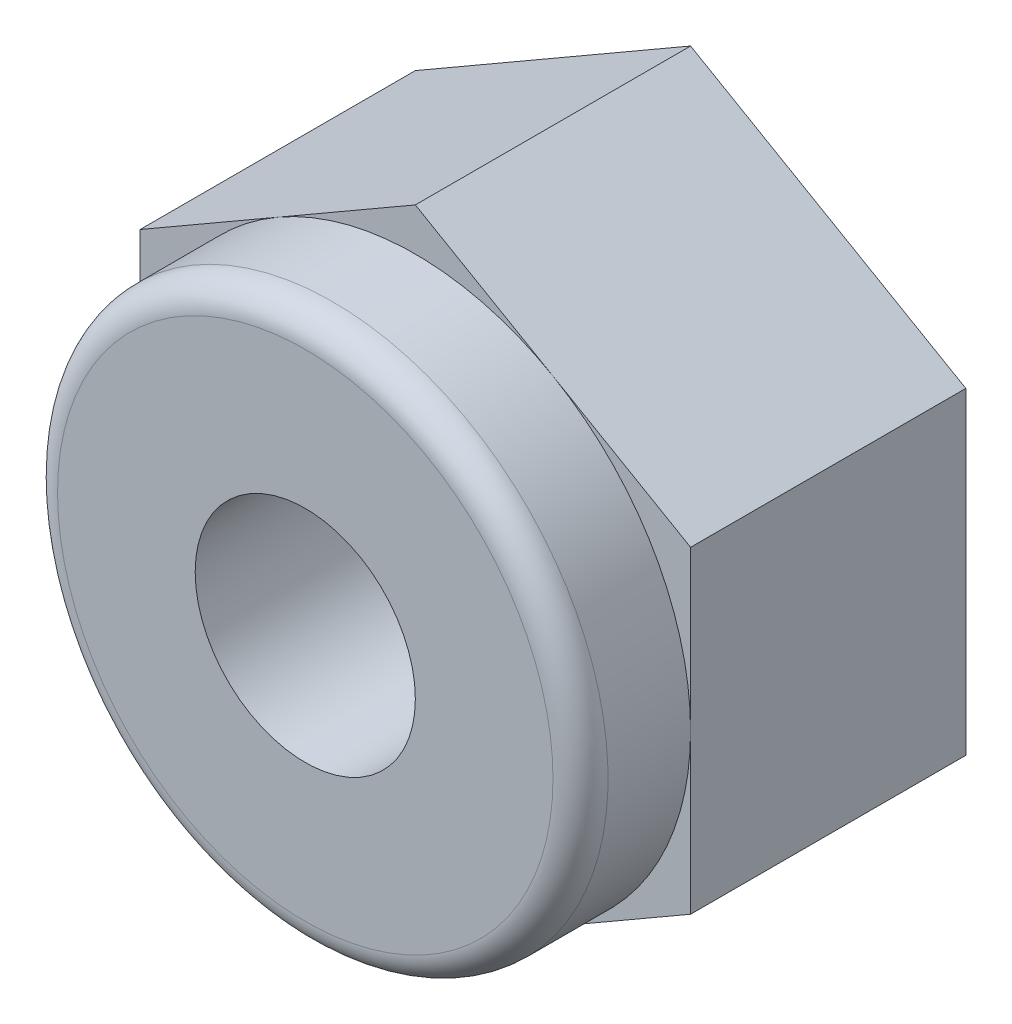
ISO-10303-21;
HEADER;
FILE_DESCRIPTION(('STEP AP214'),'2;1');
FILE_NAME('part.step','',(''),(''),'','','');
FILE_SCHEMA(('AUTOMOTIVE_DESIGN { 1 0 10303 214 1 1 1 1 }'));
ENDSEC;
DATA;
#1=APPLICATION_CONTEXT('core data for automotive mechanical design processes');
#2=APPLICATION_PROTOCOL_DEFINITION('international standard','automotive_design',2000,#1);
#3=PRODUCT_CONTEXT('',#1,'mechanical');
#4=PRODUCT('Part','Part','',(#3));
#5=PRODUCT_RELATED_PRODUCT_CATEGORY('part','',(#4));
#6=PRODUCT_DEFINITION_FORMATION('','',#4);
#7=PRODUCT_DEFINITION_CONTEXT('part definition',#1,'design');
#8=PRODUCT_DEFINITION('design','',#6,#7);
#9=PRODUCT_DEFINITION_SHAPE('','',#8);
#10=(LENGTH_UNIT() NAMED_UNIT(*) SI_UNIT(.MILLI.,.METRE.));
#11=(NAMED_UNIT(*) PLANE_ANGLE_UNIT() SI_UNIT($,.RADIAN.));
#12=(NAMED_UNIT(*) SI_UNIT($,.STERADIAN.) SOLID_ANGLE_UNIT());
#13=UNCERTAINTY_MEASURE_WITH_UNIT(LENGTH_MEASURE(1.E-05),#10,'distance_accuracy_value','');
#14=(GEOMETRIC_REPRESENTATION_CONTEXT(3) GLOBAL_UNCERTAINTY_ASSIGNED_CONTEXT((#13)) GLOBAL_UNIT_ASSIGNED_CONTEXT((#10,
#11,#12)) REPRESENTATION_CONTEXT('',''));
#15=CARTESIAN_POINT('',(0.,0.,0.));
#16=DIRECTION('',(0.,0.,1.));
#17=DIRECTION('',(1.,0.,0.));
#18=AXIS2_PLACEMENT_3D('',#15,#16,#17);
#19=CARTESIAN_POINT('',(0.,0.,2.));
#20=DIRECTION('',(0.,0.,1.));
#21=DIRECTION('',(1.,0.,0.));
#22=AXIS2_PLACEMENT_3D('',#19,#20,#21);
#23=PLANE('',#22);
#24=DIRECTION('',(0.,1.,0.));
#25=VECTOR('',#24,1.);
#26=CARTESIAN_POINT('',(-2.,0.,2.));
#27=LINE('',#26,#25);
#28=CARTESIAN_POINT('',(-2.,0.,2.));
#29=VERTEX_POINT('',#28);
#30=CARTESIAN_POINT('',(-1.99999999999999,-1.15470053837926,2.));
#31=VERTEX_POINT('',#30);
#32=EDGE_CURVE('E103',#29,#31,#27,.F.);
#33=ORIENTED_EDGE('',*,*,#32,.T.);
#34=DIRECTION('',(0.866025403784442,-0.499999999999994,0.));
#35=VECTOR('',#34,1.);
#36=CARTESIAN_POINT('',(-1.99999999999999,-1.15470053837926,2.));
#37=LINE('',#36,#35);
#38=CARTESIAN_POINT('',(-0.999999999999988,-1.73205080756888,2.));
#39=VERTEX_POINT('',#38);
#40=EDGE_CURVE('E100',#31,#39,#37,.T.);
#41=ORIENTED_EDGE('',*,*,#40,.T.);
#42=CARTESIAN_POINT('',(0.,0.,2.));
#43=DIRECTION('',(0.,0.,-1.));
#44=DIRECTION('',(-1.,0.,0.));
#45=AXIS2_PLACEMENT_3D('',#42,#43,#44);
#46=CIRCLE('',#45,2.);
#47=EDGE_CURVE('E101',#29,#39,#46,.F.);
#48=ORIENTED_EDGE('',*,*,#47,.F.);
#49=EDGE_LOOP('',(#33,#41,#48));
#50=FACE_BOUND('',#49,.T.);
#51=ADVANCED_FACE('F17',(#50),#23,.T.);
#52=CARTESIAN_POINT('',(0.,0.,2.));
#53=DIRECTION('',(0.,0.,1.));
#54=DIRECTION('',(1.,0.,0.));
#55=AXIS2_PLACEMENT_3D('',#52,#53,#54);
#56=PLANE('',#55);
#57=DIRECTION('',(0.866025403784441,-0.499999999999995,0.));
#58=VECTOR('',#57,1.);
#59=CARTESIAN_POINT('',(-0.999999999999988,-1.73205080756888,2.));
#60=LINE('',#59,#58);
#61=CARTESIAN_POINT('',(0.,-2.3094010767585,2.));
#62=VERTEX_POINT('',#61);
#63=EDGE_CURVE('E107',#39,#62,#60,.T.);
#64=ORIENTED_EDGE('',*,*,#63,.T.);
#65=DIRECTION('',(0.866025403784435,0.500000000000007,0.));
#66=VECTOR('',#65,1.);
#67=CARTESIAN_POINT('',(0.,-2.3094010767585,2.));
#68=LINE('',#67,#66);
#69=CARTESIAN_POINT('',(1.00000000000001,-1.73205080756887,2.));
#70=VERTEX_POINT('',#69);
#71=EDGE_CURVE('E123',#62,#70,#68,.T.);
#72=ORIENTED_EDGE('',*,*,#71,.T.);
#73=CARTESIAN_POINT('',(0.,0.,2.));
#74=DIRECTION('',(0.,0.,-1.));
#75=DIRECTION('',(-1.,0.,0.));
#76=AXIS2_PLACEMENT_3D('',#73,#74,#75);
#77=CIRCLE('',#76,2.);
#78=EDGE_CURVE('E113',#39,#70,#77,.F.);
#79=ORIENTED_EDGE('',*,*,#78,.F.);
#80=EDGE_LOOP('',(#64,#72,#79));
#81=FACE_BOUND('',#80,.T.);
#82=ADVANCED_FACE('F125',(#81),#56,.T.);
#83=CARTESIAN_POINT('',(0.,0.,2.));
#84=DIRECTION('',(0.,0.,1.));
#85=DIRECTION('',(1.,0.,0.));
#86=AXIS2_PLACEMENT_3D('',#83,#84,#85);
#87=PLANE('',#86);
#88=DIRECTION('',(0.866025403784434,0.500000000000007,0.));
#89=VECTOR('',#88,1.);
#90=CARTESIAN_POINT('',(1.00000000000001,-1.73205080756887,2.));
#91=LINE('',#90,#89);
#92=CARTESIAN_POINT('',(2.00000000000001,-1.15470053837923,2.));
#93=VERTEX_POINT('',#92);
#94=EDGE_CURVE('E181',#70,#93,#91,.T.);
#95=ORIENTED_EDGE('',*,*,#94,.T.);
#96=DIRECTION('',(0.,1.,0.));
#97=VECTOR('',#96,1.);
#98=CARTESIAN_POINT('',(2.00000000000001,0.,2.));
#99=LINE('',#98,#97);
#100=CARTESIAN_POINT('',(2.,0.,2.));
#101=VERTEX_POINT('',#100);
#102=EDGE_CURVE('E115',#93,#101,#99,.T.);
#103=ORIENTED_EDGE('',*,*,#102,.T.);
#104=CARTESIAN_POINT('',(0.,0.,2.));
#105=DIRECTION('',(0.,0.,-1.));
#106=DIRECTION('',(-1.,0.,0.));
#107=AXIS2_PLACEMENT_3D('',#104,#105,#106);
#108=CIRCLE('',#107,2.);
#109=EDGE_CURVE('E126',#70,#101,#108,.F.);
#110=ORIENTED_EDGE('',*,*,#109,.F.);
#111=EDGE_LOOP('',(#95,#103,#110));
#112=FACE_BOUND('',#111,.T.);
#113=ADVANCED_FACE('F291',(#112),#87,.T.);
#114=CARTESIAN_POINT('',(0.,0.,2.));
#115=DIRECTION('',(0.,0.,1.));
#116=DIRECTION('',(1.,0.,0.));
#117=AXIS2_PLACEMENT_3D('',#114,#115,#116);
#118=PLANE('',#117);
#119=DIRECTION('',(0.,1.,0.));
#120=VECTOR('',#119,1.);
#121=CARTESIAN_POINT('',(2.,0.,2.));
#122=LINE('',#121,#120);
#123=CARTESIAN_POINT('',(1.99999999999999,1.15470053837927,2.));
#124=VERTEX_POINT('',#123);
#125=EDGE_CURVE('E128',#101,#124,#122,.T.);
#126=ORIENTED_EDGE('',*,*,#125,.T.);
#127=DIRECTION('',(-0.866025403784442,0.499999999999995,0.));
#128=VECTOR('',#127,1.);
#129=CARTESIAN_POINT('',(1.99999999999998,1.15470053837927,2.));
#130=LINE('',#129,#128);
#131=CARTESIAN_POINT('',(0.99999999999999,1.73205080756888,2.));
#132=VERTEX_POINT('',#131);
#133=EDGE_CURVE('E201',#124,#132,#130,.T.);
#134=ORIENTED_EDGE('',*,*,#133,.T.);
#135=CARTESIAN_POINT('',(0.,0.,2.));
#136=DIRECTION('',(0.,0.,-1.));
#137=DIRECTION('',(-1.,0.,0.));
#138=AXIS2_PLACEMENT_3D('',#135,#136,#137);
#139=CIRCLE('',#138,2.);
#140=EDGE_CURVE('E141',#101,#132,#139,.F.);
#141=ORIENTED_EDGE('',*,*,#140,.F.);
#142=EDGE_LOOP('',(#126,#134,#141));
#143=FACE_BOUND('',#142,.T.);
#144=ADVANCED_FACE('F408',(#143),#118,.T.);
#145=CARTESIAN_POINT('',(0.,0.,2.));
#146=DIRECTION('',(0.,0.,1.));
#147=DIRECTION('',(1.,0.,0.));
#148=AXIS2_PLACEMENT_3D('',#145,#146,#147);
#149=PLANE('',#148);
#150=DIRECTION('',(-0.866025403784442,0.499999999999995,0.));
#151=VECTOR('',#150,1.);
#152=CARTESIAN_POINT('',(0.999999999999992,1.73205080756889,2.));
#153=LINE('',#152,#151);
#154=CARTESIAN_POINT('',(0.,2.3094010767585,2.));
#155=VERTEX_POINT('',#154);
#156=EDGE_CURVE('E205',#132,#155,#153,.T.);
#157=ORIENTED_EDGE('',*,*,#156,.T.);
#158=DIRECTION('',(-0.866025403784438,-0.500000000000001,0.));
#159=VECTOR('',#158,1.);
#160=CARTESIAN_POINT('',(0.,2.3094010767585,2.));
#161=LINE('',#160,#159);
#162=CARTESIAN_POINT('',(-1.,1.73205080756887,2.));
#163=VERTEX_POINT('',#162);
#164=EDGE_CURVE('E197',#155,#163,#161,.T.);
#165=ORIENTED_EDGE('',*,*,#164,.T.);
#166=CARTESIAN_POINT('',(0.,0.,2.));
#167=DIRECTION('',(0.,0.,-1.));
#168=DIRECTION('',(-1.,0.,0.));
#169=AXIS2_PLACEMENT_3D('',#166,#167,#168);
#170=CIRCLE('',#169,2.);
#171=EDGE_CURVE('E140',#132,#163,#170,.F.);
#172=ORIENTED_EDGE('',*,*,#171,.F.);
#173=EDGE_LOOP('',(#157,#165,#172));
#174=FACE_BOUND('',#173,.T.);
#175=ADVANCED_FACE('F224',(#174),#149,.T.);
#176=CARTESIAN_POINT('',(0.,0.,2.6));
#177=DIRECTION('',(0.,0.,1.));
#178=DIRECTION('',(1.,0.,0.));
#179=AXIS2_PLACEMENT_3D('',#176,#177,#178);
#180=TOROIDAL_SURFACE('',#179,1.8,0.2);
#181=CARTESIAN_POINT('',(0.,0.,2.6));
#182=DIRECTION('',(0.,0.,-1.));
#183=DIRECTION('',(-1.,0.,0.));
#184=AXIS2_PLACEMENT_3D('',#181,#182,#183);
#185=CIRCLE('',#184,2.);
#186=CARTESIAN_POINT('',(-2.,0.,2.6));
#187=VERTEX_POINT('',#186);
#188=EDGE_CURVE('E145',#187,#187,#185,.T.);
#189=ORIENTED_EDGE('',*,*,#188,.F.);
#190=EDGE_LOOP('',(#189));
#191=FACE_BOUND('',#190,.T.);
#192=CARTESIAN_POINT('',(0.,0.,2.8));
#193=DIRECTION('',(0.,0.,-1.));
#194=DIRECTION('',(1.,0.,0.));
#195=AXIS2_PLACEMENT_3D('',#192,#193,#194);
#196=CIRCLE('',#195,1.8);
#197=CARTESIAN_POINT('',(-1.8,0.,2.8));
#198=VERTEX_POINT('',#197);
#199=CARTESIAN_POINT('',(1.8,0.,2.8));
#200=VERTEX_POINT('',#199);
#201=EDGE_CURVE('E136',#198,#200,#196,.F.);
#202=ORIENTED_EDGE('',*,*,#201,.F.);
#203=CARTESIAN_POINT('',(0.,0.,2.8));
#204=DIRECTION('',(0.,0.,-1.));
#205=DIRECTION('',(-1.,0.,0.));
#206=AXIS2_PLACEMENT_3D('',#203,#204,#205);
#207=CIRCLE('',#206,1.8);
#208=EDGE_CURVE('E134',#200,#198,#207,.F.);
#209=ORIENTED_EDGE('',*,*,#208,.F.);
#210=EDGE_LOOP('',(#202,#209));
#211=FACE_BOUND('',#210,.T.);
#212=ADVANCED_FACE('F135',(#191,#211),#180,.T.);
#213=CARTESIAN_POINT('',(0.,0.,2.8));
#214=DIRECTION('',(0.,0.,-1.));
#215=DIRECTION('',(-1.,0.,0.));
#216=AXIS2_PLACEMENT_3D('',#213,#214,#215);
#217=CYLINDRICAL_SURFACE('',#216,2.);
#218=ORIENTED_EDGE('',*,*,#188,.T.);
#219=EDGE_LOOP('',(#218));
#220=FACE_BOUND('',#219,.T.);
#221=CARTESIAN_POINT('',(0.,0.,2.));
#222=DIRECTION('',(0.,0.,-1.));
#223=DIRECTION('',(-1.,0.,0.));
#224=AXIS2_PLACEMENT_3D('',#221,#222,#223);
#225=CIRCLE('',#224,2.);
#226=EDGE_CURVE('E94',#29,#163,#225,.T.);
#227=ORIENTED_EDGE('',*,*,#226,.F.);
#228=ORIENTED_EDGE('',*,*,#47,.T.);
#229=ORIENTED_EDGE('',*,*,#78,.T.);
#230=ORIENTED_EDGE('',*,*,#109,.T.);
#231=ORIENTED_EDGE('',*,*,#140,.T.);
#232=ORIENTED_EDGE('',*,*,#171,.T.);
#233=EDGE_LOOP('',(#227,#228,#229,#230,#231,#232));
#234=FACE_BOUND('',#233,.T.);
#235=ADVANCED_FACE('F110',(#220,#234),#217,.T.);
#236=CARTESIAN_POINT('',(0.,0.,2.8));
#237=DIRECTION('',(0.,0.,1.));
#238=DIRECTION('',(1.,0.,0.));
#239=AXIS2_PLACEMENT_3D('',#236,#237,#238);
#240=PLANE('',#239);
#241=ORIENTED_EDGE('',*,*,#208,.T.);
#242=ORIENTED_EDGE('',*,*,#201,.T.);
#243=EDGE_LOOP('',(#241,#242));
#244=FACE_BOUND('',#243,.T.);
#245=CARTESIAN_POINT('',(0.,0.,2.8));
#246=DIRECTION('',(0.,0.,1.));
#247=DIRECTION('',(1.,0.,0.));
#248=AXIS2_PLACEMENT_3D('',#245,#246,#247);
#249=CIRCLE('',#248,0.8);
#250=CARTESIAN_POINT('',(0.8,0.,2.8));
#251=VERTEX_POINT('',#250);
#252=EDGE_CURVE('E149',#251,#251,#249,.F.);
#253=ORIENTED_EDGE('',*,*,#252,.T.);
#254=EDGE_LOOP('',(#253));
#255=FACE_BOUND('',#254,.T.);
#256=ADVANCED_FACE('F235',(#244,#255),#240,.T.);
#257=CARTESIAN_POINT('',(0.,0.,2.));
#258=DIRECTION('',(0.,0.,1.));
#259=DIRECTION('',(1.,0.,0.));
#260=AXIS2_PLACEMENT_3D('',#257,#258,#259);
#261=PLANE('',#260);
#262=DIRECTION('',(0.866025403784438,0.500000000000001,0.));
#263=VECTOR('',#262,1.);
#264=CARTESIAN_POINT('',(0.,2.3094010767585,2.));
#265=LINE('',#264,#263);
#266=CARTESIAN_POINT('',(-2.,1.15470053837925,2.));
#267=VERTEX_POINT('',#266);
#268=EDGE_CURVE('E152',#163,#267,#265,.F.);
#269=ORIENTED_EDGE('',*,*,#268,.T.);
#270=DIRECTION('',(0.,1.,0.));
#271=VECTOR('',#270,1.);
#272=CARTESIAN_POINT('',(-2.,0.,2.));
#273=LINE('',#272,#271);
#274=EDGE_CURVE('E148',#267,#29,#273,.F.);
#275=ORIENTED_EDGE('',*,*,#274,.T.);
#276=ORIENTED_EDGE('',*,*,#226,.T.);
#277=EDGE_LOOP('',(#269,#275,#276));
#278=FACE_BOUND('',#277,.T.);
#279=ADVANCED_FACE('F244',(#278),#261,.T.);
#280=CARTESIAN_POINT('',(0.,0.,2.8));
#281=DIRECTION('',(0.,0.,1.));
#282=DIRECTION('',(1.,0.,0.));
#283=AXIS2_PLACEMENT_3D('',#280,#281,#282);
#284=CYLINDRICAL_SURFACE('',#283,0.8);
#285=CARTESIAN_POINT('',(0.,0.,0.));
#286=DIRECTION('',(0.,0.,1.));
#287=DIRECTION('',(1.,0.,0.));
#288=AXIS2_PLACEMENT_3D('',#285,#286,#287);
#289=CIRCLE('',#288,0.8);
#290=CARTESIAN_POINT('',(0.8,0.,0.));
#291=VERTEX_POINT('',#290);
#292=EDGE_CURVE('E153',#291,#291,#289,.F.);
#293=ORIENTED_EDGE('',*,*,#292,.T.);
#294=EDGE_LOOP('',(#293));
#295=FACE_BOUND('',#294,.T.);
#296=ORIENTED_EDGE('',*,*,#252,.F.);
#297=EDGE_LOOP('',(#296));
#298=FACE_BOUND('',#297,.T.);
#299=ADVANCED_FACE('F314',(#295,#298),#284,.F.);
#300=CARTESIAN_POINT('',(0.,2.3094010767585,2.));
#301=DIRECTION('',(0.500000000000001,-0.866025403784438,0.));
#302=DIRECTION('',(0.866025403784438,0.500000000000001,0.));
#303=AXIS2_PLACEMENT_3D('',#300,#301,#302);
#304=PLANE('',#303);
#305=DIRECTION('',(0.,0.,1.));
#306=VECTOR('',#305,1.);
#307=CARTESIAN_POINT('',(-2.,1.15470053837925,2.));
#308=LINE('',#307,#306);
#309=CARTESIAN_POINT('',(-2.,1.15470053837925,0.));
#310=VERTEX_POINT('',#309);
#311=EDGE_CURVE('E162',#310,#267,#308,.T.);
#312=ORIENTED_EDGE('',*,*,#311,.T.);
#313=ORIENTED_EDGE('',*,*,#268,.F.);
#314=ORIENTED_EDGE('',*,*,#164,.F.);
#315=DIRECTION('',(0.,0.,1.));
#316=VECTOR('',#315,1.);
#317=CARTESIAN_POINT('',(0.,2.3094010767585,2.));
#318=LINE('',#317,#316);
#319=CARTESIAN_POINT('',(0.,2.3094010767585,0.));
#320=VERTEX_POINT('',#319);
#321=EDGE_CURVE('E157',#155,#320,#318,.F.);
#322=ORIENTED_EDGE('',*,*,#321,.T.);
#323=DIRECTION('',(-0.866025403784438,-0.500000000000001,0.));
#324=VECTOR('',#323,1.);
#325=CARTESIAN_POINT('',(0.,2.3094010767585,0.));
#326=LINE('',#325,#324);
#327=EDGE_CURVE('E156',#320,#310,#326,.T.);
#328=ORIENTED_EDGE('',*,*,#327,.T.);
#329=EDGE_LOOP('',(#312,#313,#314,#322,#328));
#330=FACE_BOUND('',#329,.T.);
#331=ADVANCED_FACE('F301',(#330),#304,.F.);
#332=CARTESIAN_POINT('',(-2.,1.15470053837925,2.));
#333=DIRECTION('',(1.,0.,0.));
#334=DIRECTION('',(0.,1.,0.));
#335=AXIS2_PLACEMENT_3D('',#332,#333,#334);
#336=PLANE('',#335);
#337=DIRECTION('',(0.,0.,1.));
#338=VECTOR('',#337,1.);
#339=CARTESIAN_POINT('',(-1.99999999999999,-1.15470053837926,2.));
#340=LINE('',#339,#338);
#341=CARTESIAN_POINT('',(-1.99999999999999,-1.15470053837926,0.));
#342=VERTEX_POINT('',#341);
#343=EDGE_CURVE('E160',#342,#31,#340,.T.);
#344=ORIENTED_EDGE('',*,*,#343,.T.);
#345=ORIENTED_EDGE('',*,*,#32,.F.);
#346=ORIENTED_EDGE('',*,*,#274,.F.);
#347=ORIENTED_EDGE('',*,*,#311,.F.);
#348=DIRECTION('',(0.,1.,0.));
#349=VECTOR('',#348,1.);
#350=CARTESIAN_POINT('',(-2.,0.,0.));
#351=LINE('',#350,#349);
#352=EDGE_CURVE('E268',#310,#342,#351,.F.);
#353=ORIENTED_EDGE('',*,*,#352,.T.);
#354=EDGE_LOOP('',(#344,#345,#346,#347,#353));
#355=FACE_BOUND('',#354,.T.);
#356=ADVANCED_FACE('F304',(#355),#336,.F.);
#357=CARTESIAN_POINT('',(-1.99999999999999,-1.15470053837926,2.));
#358=DIRECTION('',(0.499999999999995,0.866025403784442,0.));
#359=DIRECTION('',(-0.866025403784442,0.499999999999995,0.));
#360=AXIS2_PLACEMENT_3D('',#357,#358,#359);
#361=PLANE('',#360);
#362=DIRECTION('',(0.,0.,1.));
#363=VECTOR('',#362,1.);
#364=CARTESIAN_POINT('',(0.,-2.3094010767585,2.));
#365=LINE('',#364,#363);
#366=CARTESIAN_POINT('',(0.,-2.3094010767585,0.));
#367=VERTEX_POINT('',#366);
#368=EDGE_CURVE('E120',#367,#62,#365,.T.);
#369=ORIENTED_EDGE('',*,*,#368,.T.);
#370=ORIENTED_EDGE('',*,*,#63,.F.);
#371=ORIENTED_EDGE('',*,*,#40,.F.);
#372=ORIENTED_EDGE('',*,*,#343,.F.);
#373=DIRECTION('',(0.866025403784441,-0.499999999999995,0.));
#374=VECTOR('',#373,1.);
#375=CARTESIAN_POINT('',(-1.99999999999999,-1.15470053837926,0.));
#376=LINE('',#375,#374);
#377=EDGE_CURVE('E271',#342,#367,#376,.T.);
#378=ORIENTED_EDGE('',*,*,#377,.T.);
#379=EDGE_LOOP('',(#369,#370,#371,#372,#378));
#380=FACE_BOUND('',#379,.T.);
#381=ADVANCED_FACE('F118',(#380),#361,.F.);
#382=CARTESIAN_POINT('',(0.,-2.3094010767585,2.));
#383=DIRECTION('',(-0.500000000000007,0.866025403784435,0.));
#384=DIRECTION('',(-0.866025403784435,-0.500000000000007,0.));
#385=AXIS2_PLACEMENT_3D('',#382,#383,#384);
#386=PLANE('',#385);
#387=DIRECTION('',(0.,0.,1.));
#388=VECTOR('',#387,1.);
#389=CARTESIAN_POINT('',(2.00000000000001,-1.15470053837923,2.));
#390=LINE('',#389,#388);
#391=CARTESIAN_POINT('',(2.00000000000001,-1.15470053837923,0.));
#392=VERTEX_POINT('',#391);
#393=EDGE_CURVE('E166',#392,#93,#390,.T.);
#394=ORIENTED_EDGE('',*,*,#393,.T.);
#395=ORIENTED_EDGE('',*,*,#94,.F.);
#396=ORIENTED_EDGE('',*,*,#71,.F.);
#397=ORIENTED_EDGE('',*,*,#368,.F.);
#398=DIRECTION('',(0.866025403784435,0.500000000000007,0.));
#399=VECTOR('',#398,1.);
#400=CARTESIAN_POINT('',(0.,-2.3094010767585,0.));
#401=LINE('',#400,#399);
#402=EDGE_CURVE('E273',#367,#392,#401,.T.);
#403=ORIENTED_EDGE('',*,*,#402,.T.);
#404=EDGE_LOOP('',(#394,#395,#396,#397,#403));
#405=FACE_BOUND('',#404,.T.);
#406=ADVANCED_FACE('F288',(#405),#386,.F.);
#407=CARTESIAN_POINT('',(2.00000000000001,-1.15470053837923,2.));
#408=DIRECTION('',(-1.,0.,0.));
#409=DIRECTION('',(0.,-1.,0.));
#410=AXIS2_PLACEMENT_3D('',#407,#408,#409);
#411=PLANE('',#410);
#412=DIRECTION('',(0.,0.,1.));
#413=VECTOR('',#412,1.);
#414=CARTESIAN_POINT('',(1.99999999999998,1.15470053837927,2.));
#415=LINE('',#414,#413);
#416=CARTESIAN_POINT('',(1.99999999999999,1.15470053837927,0.));
#417=VERTEX_POINT('',#416);
#418=EDGE_CURVE('E36',#417,#124,#415,.T.);
#419=ORIENTED_EDGE('',*,*,#418,.T.);
#420=ORIENTED_EDGE('',*,*,#125,.F.);
#421=ORIENTED_EDGE('',*,*,#102,.F.);
#422=ORIENTED_EDGE('',*,*,#393,.F.);
#423=DIRECTION('',(0.,1.,0.));
#424=VECTOR('',#423,1.);
#425=CARTESIAN_POINT('',(2.00000000000001,0.,0.));
#426=LINE('',#425,#424);
#427=EDGE_CURVE('E28',#392,#417,#426,.T.);
#428=ORIENTED_EDGE('',*,*,#427,.T.);
#429=EDGE_LOOP('',(#419,#420,#421,#422,#428));
#430=FACE_BOUND('',#429,.T.);
#431=ADVANCED_FACE('F279',(#430),#411,.F.);
#432=CARTESIAN_POINT('',(1.99999999999998,1.15470053837927,2.));
#433=DIRECTION('',(-0.499999999999995,-0.866025403784442,0.));
#434=DIRECTION('',(0.866025403784442,-0.499999999999995,0.));
#435=AXIS2_PLACEMENT_3D('',#432,#433,#434);
#436=PLANE('',#435);
#437=ORIENTED_EDGE('',*,*,#321,.F.);
#438=ORIENTED_EDGE('',*,*,#156,.F.);
#439=ORIENTED_EDGE('',*,*,#133,.F.);
#440=ORIENTED_EDGE('',*,*,#418,.F.);
#441=DIRECTION('',(-0.866025403784442,0.499999999999995,0.));
#442=VECTOR('',#441,1.);
#443=CARTESIAN_POINT('',(1.99999999999998,1.15470053837927,0.));
#444=LINE('',#443,#442);
#445=EDGE_CURVE('E10',#417,#320,#444,.T.);
#446=ORIENTED_EDGE('',*,*,#445,.T.);
#447=EDGE_LOOP('',(#437,#438,#439,#440,#446));
#448=FACE_BOUND('',#447,.T.);
#449=ADVANCED_FACE('F296',(#448),#436,.F.);
#450=CARTESIAN_POINT('',(0.,0.,0.));
#451=DIRECTION('',(0.,0.,1.));
#452=DIRECTION('',(1.,0.,0.));
#453=AXIS2_PLACEMENT_3D('',#450,#451,#452);
#454=PLANE('',#453);
#455=ORIENTED_EDGE('',*,*,#427,.F.);
#456=ORIENTED_EDGE('',*,*,#402,.F.);
#457=ORIENTED_EDGE('',*,*,#377,.F.);
#458=ORIENTED_EDGE('',*,*,#352,.F.);
#459=ORIENTED_EDGE('',*,*,#327,.F.);
#460=ORIENTED_EDGE('',*,*,#445,.F.);
#461=EDGE_LOOP('',(#455,#456,#457,#458,#459,#460));
#462=FACE_BOUND('',#461,.T.);
#463=ORIENTED_EDGE('',*,*,#292,.F.);
#464=EDGE_LOOP('',(#463));
#465=FACE_BOUND('',#464,.T.);
#466=ADVANCED_FACE('F284',(#462,#465),#454,.F.);
#467=CLOSED_SHELL('',(#51,#82,#113,#144,#175,#212,#235,#256,#279,#299,#331,#356,#381,#406,#431,
#449,#466));
#468=MANIFOLD_SOLID_BREP('B1',#467);
#469=ADVANCED_BREP_SHAPE_REPRESENTATION('',(#18,#468),#14);
#470=SHAPE_DEFINITION_REPRESENTATION(#9,#469);
ENDSEC;
END-ISO-10303-21;
